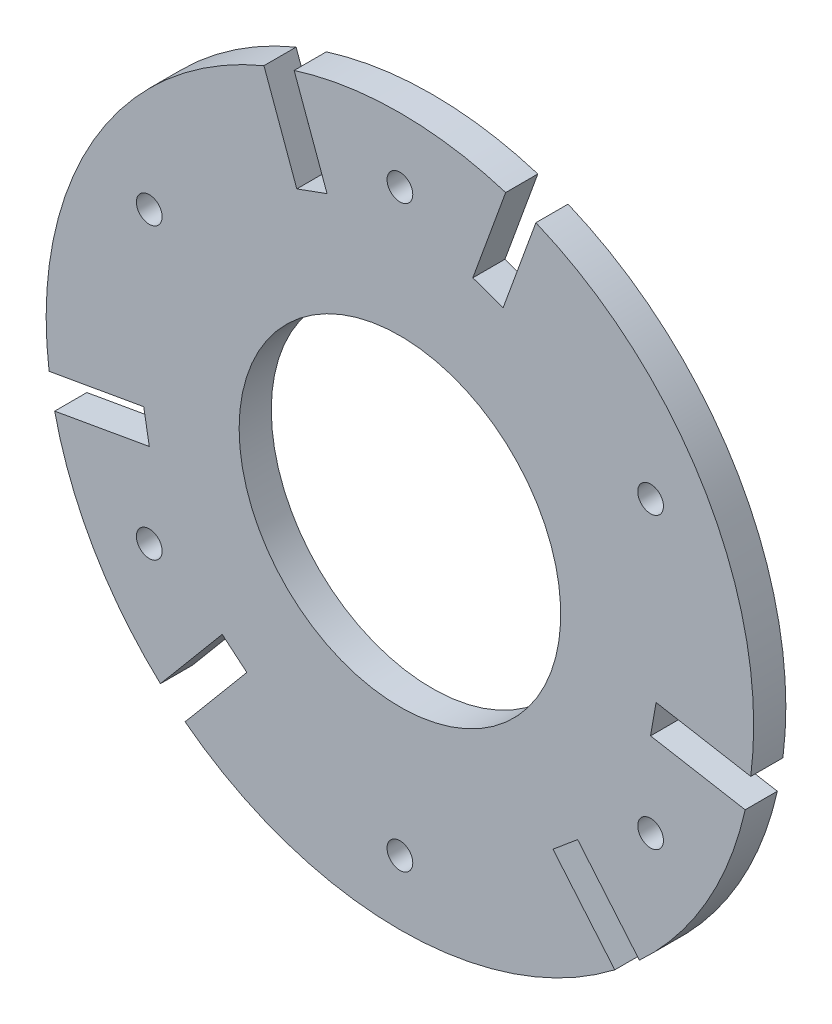
ISO-10303-21;
HEADER;
FILE_DESCRIPTION(('STEP AP214'),'2;1');
FILE_NAME('part.step','',(''),(''),'','','');
FILE_SCHEMA(('AUTOMOTIVE_DESIGN { 1 0 10303 214 1 1 1 1 }'));
ENDSEC;
DATA;
#1=APPLICATION_CONTEXT('core data for automotive mechanical design processes');
#2=APPLICATION_PROTOCOL_DEFINITION('international standard','automotive_design',2000,#1);
#3=PRODUCT_CONTEXT('',#1,'mechanical');
#4=PRODUCT('Part','Part','',(#3));
#5=PRODUCT_RELATED_PRODUCT_CATEGORY('part','',(#4));
#6=PRODUCT_DEFINITION_FORMATION('','',#4);
#7=PRODUCT_DEFINITION_CONTEXT('part definition',#1,'design');
#8=PRODUCT_DEFINITION('design','',#6,#7);
#9=PRODUCT_DEFINITION_SHAPE('','',#8);
#10=(LENGTH_UNIT() NAMED_UNIT(*) SI_UNIT(.MILLI.,.METRE.));
#11=(NAMED_UNIT(*) PLANE_ANGLE_UNIT() SI_UNIT($,.RADIAN.));
#12=(NAMED_UNIT(*) SI_UNIT($,.STERADIAN.) SOLID_ANGLE_UNIT());
#13=UNCERTAINTY_MEASURE_WITH_UNIT(LENGTH_MEASURE(1.E-05),#10,'distance_accuracy_value','');
#14=(GEOMETRIC_REPRESENTATION_CONTEXT(3) GLOBAL_UNCERTAINTY_ASSIGNED_CONTEXT((#13)) GLOBAL_UNIT_ASSIGNED_CONTEXT((#10,
#11,#12)) REPRESENTATION_CONTEXT('',''));
#15=CARTESIAN_POINT('',(0.,0.,0.));
#16=DIRECTION('',(0.,0.,1.));
#17=DIRECTION('',(1.,0.,0.));
#18=AXIS2_PLACEMENT_3D('',#15,#16,#17);
#19=CARTESIAN_POINT('',(0.,0.,5.));
#20=DIRECTION('',(0.,0.,-1.));
#21=DIRECTION('',(-1.,0.,0.));
#22=AXIS2_PLACEMENT_3D('',#19,#20,#21);
#23=CYLINDRICAL_SURFACE('',#22,55.);
#24=CARTESIAN_POINT('',(0.,0.,5.));
#25=DIRECTION('',(0.,0.,1.));
#26=DIRECTION('',(1.,0.,0.));
#27=AXIS2_PLACEMENT_3D('',#24,#25,#26);
#28=CIRCLE('',#27,55.);
#29=CARTESIAN_POINT('',(-53.6743220532715,-12.0027976789453,5.));
#30=VERTEX_POINT('',#29);
#31=CARTESIAN_POINT('',(-37.2318887330751,-40.481927589579,5.));
#32=VERTEX_POINT('',#31);
#33=EDGE_CURVE('E358',#30,#32,#28,.T.);
#34=ORIENTED_EDGE('',*,*,#33,.F.);
#35=DIRECTION('',(0.,0.,-1.));
#36=VECTOR('',#35,1.);
#37=CARTESIAN_POINT('',(-53.6743220532715,-12.0027976789453,5.));
#38=LINE('',#37,#36);
#39=CARTESIAN_POINT('',(-53.6743220532715,-12.0027976789453,0.));
#40=VERTEX_POINT('',#39);
#41=EDGE_CURVE('E228',#30,#40,#38,.T.);
#42=ORIENTED_EDGE('',*,*,#41,.T.);
#43=CARTESIAN_POINT('',(0.,0.,0.));
#44=DIRECTION('',(0.,0.,1.));
#45=DIRECTION('',(1.,0.,0.));
#46=AXIS2_PLACEMENT_3D('',#43,#44,#45);
#47=CIRCLE('',#46,55.);
#48=CARTESIAN_POINT('',(-37.2318887330751,-40.481927589579,0.));
#49=VERTEX_POINT('',#48);
#50=EDGE_CURVE('E362',#40,#49,#47,.T.);
#51=ORIENTED_EDGE('',*,*,#50,.T.);
#52=DIRECTION('',(0.,0.,-1.));
#53=VECTOR('',#52,1.);
#54=CARTESIAN_POINT('',(-37.2318887330751,-40.481927589579,5.));
#55=LINE('',#54,#53);
#56=EDGE_CURVE('E250',#49,#32,#55,.F.);
#57=ORIENTED_EDGE('',*,*,#56,.T.);
#58=EDGE_LOOP('',(#34,#42,#51,#57));
#59=FACE_BOUND('',#58,.T.);
#60=ADVANCED_FACE('F32',(#59),#23,.T.);
#61=CARTESIAN_POINT('',(-21.140896424117,50.7746245518838,0.));
#62=VERTEX_POINT('',#61);
#63=CARTESIAN_POINT('',(-54.5425629416065,-7.07875891388431,0.));
#64=VERTEX_POINT('',#63);
#65=EDGE_CURVE('E360',#62,#64,#47,.T.);
#66=ORIENTED_EDGE('',*,*,#65,.T.);
#67=DIRECTION('',(0.,0.,-1.));
#68=VECTOR('',#67,1.);
#69=CARTESIAN_POINT('',(-54.5425629416065,-7.07875891388431,5.));
#70=LINE('',#69,#68);
#71=CARTESIAN_POINT('',(-54.5425629416065,-7.07875891388431,5.));
#72=VERTEX_POINT('',#71);
#73=EDGE_CURVE('E49',#64,#72,#70,.F.);
#74=ORIENTED_EDGE('',*,*,#73,.T.);
#75=CARTESIAN_POINT('',(-21.140896424117,50.7746245518838,5.));
#76=VERTEX_POINT('',#75);
#77=EDGE_CURVE('E354',#76,#72,#28,.T.);
#78=ORIENTED_EDGE('',*,*,#77,.F.);
#79=DIRECTION('',(0.,0.,-1.));
#80=VECTOR('',#79,1.);
#81=CARTESIAN_POINT('',(-21.140896424117,50.7746245518838,5.));
#82=LINE('',#81,#80);
#83=EDGE_CURVE('E345',#76,#62,#82,.T.);
#84=ORIENTED_EDGE('',*,*,#83,.T.);
#85=EDGE_LOOP('',(#66,#74,#78,#84));
#86=FACE_BOUND('',#85,.T.);
#87=ADVANCED_FACE('F504',(#86),#23,.T.);
#88=CARTESIAN_POINT('',(37.2318887330965,-40.4819275895593,5.));
#89=VERTEX_POINT('',#88);
#90=CARTESIAN_POINT('',(53.6743220532756,-12.0027976789267,5.));
#91=VERTEX_POINT('',#90);
#92=EDGE_CURVE('E427',#89,#91,#28,.T.);
#93=ORIENTED_EDGE('',*,*,#92,.F.);
#94=DIRECTION('',(0.,0.,-1.));
#95=VECTOR('',#94,1.);
#96=CARTESIAN_POINT('',(37.2318887330965,-40.4819275895593,5.));
#97=LINE('',#96,#95);
#98=CARTESIAN_POINT('',(37.2318887330965,-40.4819275895593,0.));
#99=VERTEX_POINT('',#98);
#100=EDGE_CURVE('E275',#89,#99,#97,.T.);
#101=ORIENTED_EDGE('',*,*,#100,.T.);
#102=CARTESIAN_POINT('',(53.6743220532756,-12.0027976789267,0.));
#103=VERTEX_POINT('',#102);
#104=EDGE_CURVE('E450',#99,#103,#47,.T.);
#105=ORIENTED_EDGE('',*,*,#104,.T.);
#106=DIRECTION('',(0.,0.,-1.));
#107=VECTOR('',#106,1.);
#108=CARTESIAN_POINT('',(53.6743220532756,-12.0027976789267,5.));
#109=LINE('',#108,#107);
#110=EDGE_CURVE('E300',#103,#91,#109,.F.);
#111=ORIENTED_EDGE('',*,*,#110,.T.);
#112=EDGE_LOOP('',(#93,#101,#105,#111));
#113=FACE_BOUND('',#112,.T.);
#114=ADVANCED_FACE('F475',(#113),#23,.T.);
#115=CARTESIAN_POINT('',(-33.4016665174794,-43.6958656380108,5.));
#116=VERTEX_POINT('',#115);
#117=CARTESIAN_POINT('',(33.4016665175025,-43.6958656379932,5.));
#118=VERTEX_POINT('',#117);
#119=EDGE_CURVE('E426',#116,#118,#28,.T.);
#120=ORIENTED_EDGE('',*,*,#119,.F.);
#121=DIRECTION('',(0.,0.,-1.));
#122=VECTOR('',#121,1.);
#123=CARTESIAN_POINT('',(-33.4016665174794,-43.6958656380108,5.));
#124=LINE('',#123,#122);
#125=CARTESIAN_POINT('',(-33.4016665174794,-43.6958656380108,0.));
#126=VERTEX_POINT('',#125);
#127=EDGE_CURVE('E246',#116,#126,#124,.T.);
#128=ORIENTED_EDGE('',*,*,#127,.T.);
#129=CARTESIAN_POINT('',(33.4016665175025,-43.6958656379932,0.));
#130=VERTEX_POINT('',#129);
#131=EDGE_CURVE('E454',#126,#130,#47,.T.);
#132=ORIENTED_EDGE('',*,*,#131,.T.);
#133=DIRECTION('',(0.,0.,-1.));
#134=VECTOR('',#133,1.);
#135=CARTESIAN_POINT('',(33.4016665175025,-43.6958656379932,5.));
#136=LINE('',#135,#134);
#137=EDGE_CURVE('E271',#130,#118,#136,.F.);
#138=ORIENTED_EDGE('',*,*,#137,.T.);
#139=EDGE_LOOP('',(#120,#128,#132,#138));
#140=FACE_BOUND('',#139,.T.);
#141=ADVANCED_FACE('F466',(#140),#23,.T.);
#142=CARTESIAN_POINT('',(54.5425629416089,-7.07875891386547,5.));
#143=VERTEX_POINT('',#142);
#144=CARTESIAN_POINT('',(21.140896424117,50.7746245518838,5.));
#145=VERTEX_POINT('',#144);
#146=EDGE_CURVE('E431',#143,#145,#28,.T.);
#147=ORIENTED_EDGE('',*,*,#146,.F.);
#148=DIRECTION('',(0.,0.,-1.));
#149=VECTOR('',#148,1.);
#150=CARTESIAN_POINT('',(54.5425629416089,-7.07875891386547,5.));
#151=LINE('',#150,#149);
#152=CARTESIAN_POINT('',(54.5425629416089,-7.07875891386547,0.));
#153=VERTEX_POINT('',#152);
#154=EDGE_CURVE('E295',#143,#153,#151,.T.);
#155=ORIENTED_EDGE('',*,*,#154,.T.);
#156=CARTESIAN_POINT('',(21.140896424117,50.7746245518838,0.));
#157=VERTEX_POINT('',#156);
#158=EDGE_CURVE('E449',#153,#157,#47,.T.);
#159=ORIENTED_EDGE('',*,*,#158,.T.);
#160=DIRECTION('',(0.,0.,-1.));
#161=VECTOR('',#160,1.);
#162=CARTESIAN_POINT('',(21.140896424117,50.7746245518838,5.));
#163=LINE('',#162,#161);
#164=EDGE_CURVE('E325',#157,#145,#163,.F.);
#165=ORIENTED_EDGE('',*,*,#164,.T.);
#166=EDGE_LOOP('',(#147,#155,#159,#165));
#167=FACE_BOUND('',#166,.T.);
#168=ADVANCED_FACE('F485',(#167),#23,.T.);
#169=CARTESIAN_POINT('',(16.4424333201875,52.4847252685121,5.));
#170=VERTEX_POINT('',#169);
#171=CARTESIAN_POINT('',(-16.4424333201875,52.4847252685121,5.));
#172=VERTEX_POINT('',#171);
#173=EDGE_CURVE('E359',#170,#172,#28,.T.);
#174=ORIENTED_EDGE('',*,*,#173,.F.);
#175=DIRECTION('',(0.,0.,-1.));
#176=VECTOR('',#175,1.);
#177=CARTESIAN_POINT('',(16.4424333201875,52.4847252685121,5.));
#178=LINE('',#177,#176);
#179=CARTESIAN_POINT('',(16.4424333201875,52.4847252685121,0.));
#180=VERTEX_POINT('',#179);
#181=EDGE_CURVE('E320',#170,#180,#178,.T.);
#182=ORIENTED_EDGE('',*,*,#181,.T.);
#183=CARTESIAN_POINT('',(-16.4424333201875,52.4847252685121,0.));
#184=VERTEX_POINT('',#183);
#185=EDGE_CURVE('E353',#180,#184,#47,.T.);
#186=ORIENTED_EDGE('',*,*,#185,.T.);
#187=DIRECTION('',(0.,0.,-1.));
#188=VECTOR('',#187,1.);
#189=CARTESIAN_POINT('',(-16.4424333201875,52.4847252685121,5.));
#190=LINE('',#189,#188);
#191=EDGE_CURVE('E350',#184,#172,#190,.F.);
#192=ORIENTED_EDGE('',*,*,#191,.T.);
#193=EDGE_LOOP('',(#174,#182,#186,#192));
#194=FACE_BOUND('',#193,.T.);
#195=ADVANCED_FACE('F34',(#194),#23,.T.);
#196=CARTESIAN_POINT('',(0.,0.,5.));
#197=DIRECTION('',(0.,0.,1.));
#198=DIRECTION('',(1.,0.,0.));
#199=AXIS2_PLACEMENT_3D('',#196,#197,#198);
#200=PLANE('',#199);
#201=CARTESIAN_POINT('',(0.,0.,5.));
#202=DIRECTION('',(0.,0.,-1.));
#203=DIRECTION('',(-1.,0.,0.));
#204=AXIS2_PLACEMENT_3D('',#201,#202,#203);
#205=CIRCLE('',#204,25.);
#206=CARTESIAN_POINT('',(-25.,0.,5.));
#207=VERTEX_POINT('',#206);
#208=EDGE_CURVE('E765',#207,#207,#205,.T.);
#209=ORIENTED_EDGE('',*,*,#208,.T.);
#210=EDGE_LOOP('',(#209));
#211=FACE_BOUND('',#210,.T.);
#212=CARTESIAN_POINT('',(38.9711431702999,22.4999999999996,5.));
#213=DIRECTION('',(0.,0.,1.));
#214=DIRECTION('',(1.,0.,0.));
#215=AXIS2_PLACEMENT_3D('',#212,#213,#214);
#216=CIRCLE('',#215,2.);
#217=CARTESIAN_POINT('',(40.9711431702999,22.4999999999996,5.));
#218=VERTEX_POINT('',#217);
#219=EDGE_CURVE('E401',#218,#218,#216,.T.);
#220=ORIENTED_EDGE('',*,*,#219,.F.);
#221=EDGE_LOOP('',(#220));
#222=FACE_BOUND('',#221,.T.);
#223=CARTESIAN_POINT('',(-38.9711431702997,-22.5,5.));
#224=DIRECTION('',(0.,0.,1.));
#225=DIRECTION('',(1.,0.,0.));
#226=AXIS2_PLACEMENT_3D('',#223,#224,#225);
#227=CIRCLE('',#226,2.);
#228=CARTESIAN_POINT('',(-36.9711431702997,-22.5,5.));
#229=VERTEX_POINT('',#228);
#230=EDGE_CURVE('E391',#229,#229,#227,.T.);
#231=ORIENTED_EDGE('',*,*,#230,.F.);
#232=EDGE_LOOP('',(#231));
#233=FACE_BOUND('',#232,.T.);
#234=CARTESIAN_POINT('',(38.9711431702997,-22.5,5.));
#235=DIRECTION('',(0.,0.,1.));
#236=DIRECTION('',(1.,0.,0.));
#237=AXIS2_PLACEMENT_3D('',#234,#235,#236);
#238=CIRCLE('',#237,2.);
#239=CARTESIAN_POINT('',(40.9711431702997,-22.5,5.));
#240=VERTEX_POINT('',#239);
#241=EDGE_CURVE('E388',#240,#240,#238,.T.);
#242=ORIENTED_EDGE('',*,*,#241,.F.);
#243=EDGE_LOOP('',(#242));
#244=FACE_BOUND('',#243,.T.);
#245=CARTESIAN_POINT('',(-38.9711431702996,22.5000000000002,5.));
#246=DIRECTION('',(0.,0.,1.));
#247=DIRECTION('',(1.,0.,0.));
#248=AXIS2_PLACEMENT_3D('',#245,#246,#247);
#249=CIRCLE('',#248,2.);
#250=CARTESIAN_POINT('',(-36.9711431702996,22.5000000000002,5.));
#251=VERTEX_POINT('',#250);
#252=EDGE_CURVE('E385',#251,#251,#249,.T.);
#253=ORIENTED_EDGE('',*,*,#252,.F.);
#254=EDGE_LOOP('',(#253));
#255=FACE_BOUND('',#254,.T.);
#256=CARTESIAN_POINT('',(0.,-45.,5.));
#257=DIRECTION('',(0.,0.,1.));
#258=DIRECTION('',(1.,0.,0.));
#259=AXIS2_PLACEMENT_3D('',#256,#257,#258);
#260=CIRCLE('',#259,2.);
#261=CARTESIAN_POINT('',(2.00000000000001,-45.,5.));
#262=VERTEX_POINT('',#261);
#263=EDGE_CURVE('E381',#262,#262,#260,.T.);
#264=ORIENTED_EDGE('',*,*,#263,.F.);
#265=EDGE_LOOP('',(#264));
#266=FACE_BOUND('',#265,.T.);
#267=CARTESIAN_POINT('',(0.,45.,5.));
#268=DIRECTION('',(0.,0.,1.));
#269=DIRECTION('',(1.,0.,0.));
#270=AXIS2_PLACEMENT_3D('',#267,#268,#269);
#271=CIRCLE('',#270,2.);
#272=CARTESIAN_POINT('',(2.,45.,5.));
#273=VERTEX_POINT('',#272);
#274=EDGE_CURVE('E220',#273,#273,#271,.T.);
#275=ORIENTED_EDGE('',*,*,#274,.F.);
#276=EDGE_LOOP('',(#275));
#277=FACE_BOUND('',#276,.T.);
#278=DIRECTION('',(0.984807753012207,0.173648177666937,0.));
#279=VECTOR('',#278,1.);
#280=CARTESIAN_POINT('',(-38.9618236684253,-9.4085872600671,5.));
#281=LINE('',#280,#279);
#282=CARTESIAN_POINT('',(-38.9618236684253,-9.4085872600671,5.));
#283=VERTEX_POINT('',#282);
#284=EDGE_CURVE('E215',#30,#283,#281,.T.);
#285=ORIENTED_EDGE('',*,*,#284,.F.);
#286=ORIENTED_EDGE('',*,*,#33,.T.);
#287=DIRECTION('',(-0.642787609686543,-0.766044443118975,0.));
#288=VECTOR('',#287,1.);
#289=CARTESIAN_POINT('',(-27.6289874151446,-29.0376354446078,5.));
#290=LINE('',#289,#288);
#291=CARTESIAN_POINT('',(-27.6289874151446,-29.0376354446078,5.));
#292=VERTEX_POINT('',#291);
#293=EDGE_CURVE('E234',#292,#32,#290,.T.);
#294=ORIENTED_EDGE('',*,*,#293,.F.);
#295=DIRECTION('',(-0.766044443118975,0.642787609686543,0.));
#296=VECTOR('',#295,1.);
#297=CARTESIAN_POINT('',(-23.7987651995497,-32.2515734930406,5.));
#298=LINE('',#297,#296);
#299=CARTESIAN_POINT('',(-23.7987651995497,-32.2515734930406,5.));
#300=VERTEX_POINT('',#299);
#301=EDGE_CURVE('E239',#300,#292,#298,.T.);
#302=ORIENTED_EDGE('',*,*,#301,.F.);
#303=DIRECTION('',(0.642787609686544,0.766044443118974,0.));
#304=VECTOR('',#303,1.);
#305=CARTESIAN_POINT('',(-33.4405793448479,-43.7422401398252,5.));
#306=LINE('',#305,#304);
#307=EDGE_CURVE('E231',#116,#300,#306,.T.);
#308=ORIENTED_EDGE('',*,*,#307,.F.);
#309=ORIENTED_EDGE('',*,*,#119,.T.);
#310=DIRECTION('',(0.642787609686545,-0.766044443118974,0.));
#311=VECTOR('',#310,1.);
#312=CARTESIAN_POINT('',(33.4405793448734,-43.7422401398104,5.));
#313=LINE('',#312,#311);
#314=CARTESIAN_POINT('',(23.7987651995753,-32.2515734930258,5.));
#315=VERTEX_POINT('',#314);
#316=EDGE_CURVE('E264',#315,#118,#313,.T.);
#317=ORIENTED_EDGE('',*,*,#316,.F.);
#318=DIRECTION('',(-0.766044443118974,-0.642787609686544,0.));
#319=VECTOR('',#318,1.);
#320=CARTESIAN_POINT('',(23.7987651995753,-32.2515734930258,5.));
#321=LINE('',#320,#319);
#322=CARTESIAN_POINT('',(27.6289874151701,-29.0376354445931,5.));
#323=VERTEX_POINT('',#322);
#324=EDGE_CURVE('E253',#323,#315,#321,.T.);
#325=ORIENTED_EDGE('',*,*,#324,.F.);
#326=DIRECTION('',(-0.642787609686544,0.766044443118974,0.));
#327=VECTOR('',#326,1.);
#328=CARTESIAN_POINT('',(27.6289874151701,-29.0376354445931,5.));
#329=LINE('',#328,#327);
#330=EDGE_CURVE('E258',#89,#323,#329,.T.);
#331=ORIENTED_EDGE('',*,*,#330,.F.);
#332=ORIENTED_EDGE('',*,*,#92,.T.);
#333=DIRECTION('',(0.984807753012207,-0.173648177666936,0.));
#334=VECTOR('',#333,1.);
#335=CARTESIAN_POINT('',(38.9618236684509,-9.40858726005234,5.));
#336=LINE('',#335,#334);
#337=CARTESIAN_POINT('',(38.9618236684509,-9.40858726005234,5.));
#338=VERTEX_POINT('',#337);
#339=EDGE_CURVE('E283',#338,#91,#336,.T.);
#340=ORIENTED_EDGE('',*,*,#339,.F.);
#341=DIRECTION('',(-0.173648177666935,-0.984807753012207,0.));
#342=VECTOR('',#341,1.);
#343=CARTESIAN_POINT('',(39.8300645567856,-4.4845484949913,5.));
#344=LINE('',#343,#342);
#345=CARTESIAN_POINT('',(39.8300645567856,-4.4845484949913,5.));
#346=VERTEX_POINT('',#345);
#347=EDGE_CURVE('E288',#346,#338,#344,.T.);
#348=ORIENTED_EDGE('',*,*,#347,.F.);
#349=DIRECTION('',(-0.984807753012207,0.173648177666936,0.));
#350=VECTOR('',#349,1.);
#351=CARTESIAN_POINT('',(54.6021808519687,-7.08927115999535,5.));
#352=LINE('',#351,#350);
#353=EDGE_CURVE('E278',#143,#346,#352,.T.);
#354=ORIENTED_EDGE('',*,*,#353,.F.);
#355=ORIENTED_EDGE('',*,*,#146,.T.);
#356=DIRECTION('',(0.342020143325662,0.939692620785911,0.));
#357=VECTOR('',#356,1.);
#358=CARTESIAN_POINT('',(21.1616015070952,50.8315112998343,5.));
#359=LINE('',#358,#357);
#360=CARTESIAN_POINT('',(16.0312993572103,36.7361219880456,5.));
#361=VERTEX_POINT('',#360);
#362=EDGE_CURVE('E303',#361,#145,#359,.T.);
#363=ORIENTED_EDGE('',*,*,#362,.F.);
#364=DIRECTION('',(0.939692620785911,-0.342020143325662,0.));
#365=VECTOR('',#364,1.);
#366=CARTESIAN_POINT('',(16.0312993572103,36.7361219880456,5.));
#367=LINE('',#366,#365);
#368=CARTESIAN_POINT('',(11.3328362532807,38.446222704674,5.));
#369=VERTEX_POINT('',#368);
#370=EDGE_CURVE('E308',#369,#361,#367,.T.);
#371=ORIENTED_EDGE('',*,*,#370,.F.);
#372=DIRECTION('',(-0.342020143325663,-0.939692620785911,0.));
#373=VECTOR('',#372,1.);
#374=CARTESIAN_POINT('',(11.3328362532807,38.446222704674,5.));
#375=LINE('',#374,#373);
#376=EDGE_CURVE('E314',#170,#369,#375,.T.);
#377=ORIENTED_EDGE('',*,*,#376,.F.);
#378=ORIENTED_EDGE('',*,*,#173,.T.);
#379=DIRECTION('',(-0.342020143325663,0.93969262078591,0.));
#380=VECTOR('',#379,1.);
#381=CARTESIAN_POINT('',(-11.3328362532807,38.446222704674,5.));
#382=LINE('',#381,#380);
#383=CARTESIAN_POINT('',(-11.3328362532807,38.446222704674,5.));
#384=VERTEX_POINT('',#383);
#385=EDGE_CURVE('E333',#384,#172,#382,.T.);
#386=ORIENTED_EDGE('',*,*,#385,.F.);
#387=DIRECTION('',(0.93969262078591,0.342020143325663,0.));
#388=VECTOR('',#387,1.);
#389=CARTESIAN_POINT('',(-16.0312993572103,36.7361219880456,5.));
#390=LINE('',#389,#388);
#391=CARTESIAN_POINT('',(-16.0312993572103,36.7361219880456,5.));
#392=VERTEX_POINT('',#391);
#393=EDGE_CURVE('E338',#392,#384,#390,.T.);
#394=ORIENTED_EDGE('',*,*,#393,.F.);
#395=DIRECTION('',(0.342020143325663,-0.939692620785911,0.));
#396=VECTOR('',#395,1.);
#397=CARTESIAN_POINT('',(-21.1616015070952,50.8315112998343,5.));
#398=LINE('',#397,#396);
#399=EDGE_CURVE('E328',#76,#392,#398,.T.);
#400=ORIENTED_EDGE('',*,*,#399,.F.);
#401=ORIENTED_EDGE('',*,*,#77,.T.);
#402=DIRECTION('',(-0.984807753012207,-0.173648177666937,0.));
#403=VECTOR('',#402,1.);
#404=CARTESIAN_POINT('',(-54.6021808519431,-7.08927116001013,5.));
#405=LINE('',#404,#403);
#406=CARTESIAN_POINT('',(-39.83006455676,-4.48454849500607,5.));
#407=VERTEX_POINT('',#406);
#408=EDGE_CURVE('E217',#407,#72,#405,.T.);
#409=ORIENTED_EDGE('',*,*,#408,.F.);
#410=DIRECTION('',(-0.173648177666938,0.984807753012207,0.));
#411=VECTOR('',#410,1.);
#412=CARTESIAN_POINT('',(-39.83006455676,-4.48454849500607,5.));
#413=LINE('',#412,#411);
#414=EDGE_CURVE('E203',#283,#407,#413,.T.);
#415=ORIENTED_EDGE('',*,*,#414,.F.);
#416=EDGE_LOOP('',(#285,#286,#294,#302,#308,#309,#317,#325,#331,#332,#340,#348,#354,#355,#363,
#371,#377,#378,#386,#394,#400,#401,#409,#415));
#417=FACE_BOUND('',#416,.T.);
#418=ADVANCED_FACE('F412',(#211,#222,#233,#244,#255,#266,#277,#417),#200,.T.);
#419=CARTESIAN_POINT('',(0.,0.,0.));
#420=DIRECTION('',(0.,0.,1.));
#421=DIRECTION('',(1.,0.,0.));
#422=AXIS2_PLACEMENT_3D('',#419,#420,#421);
#423=PLANE('',#422);
#424=CARTESIAN_POINT('',(0.,0.,0.));
#425=DIRECTION('',(0.,0.,-1.));
#426=DIRECTION('',(-1.,0.,0.));
#427=AXIS2_PLACEMENT_3D('',#424,#425,#426);
#428=CIRCLE('',#427,25.);
#429=CARTESIAN_POINT('',(-25.,0.,0.));
#430=VERTEX_POINT('',#429);
#431=EDGE_CURVE('E750',#430,#430,#428,.T.);
#432=ORIENTED_EDGE('',*,*,#431,.F.);
#433=EDGE_LOOP('',(#432));
#434=FACE_BOUND('',#433,.T.);
#435=CARTESIAN_POINT('',(38.9711431702999,22.4999999999996,0.));
#436=DIRECTION('',(0.,0.,1.));
#437=DIRECTION('',(1.,0.,0.));
#438=AXIS2_PLACEMENT_3D('',#435,#436,#437);
#439=CIRCLE('',#438,2.);
#440=CARTESIAN_POINT('',(40.9711431702999,22.4999999999996,0.));
#441=VERTEX_POINT('',#440);
#442=EDGE_CURVE('E36',#441,#441,#439,.T.);
#443=ORIENTED_EDGE('',*,*,#442,.T.);
#444=EDGE_LOOP('',(#443));
#445=FACE_BOUND('',#444,.T.);
#446=CARTESIAN_POINT('',(-38.9711431702997,-22.5,0.));
#447=DIRECTION('',(0.,0.,1.));
#448=DIRECTION('',(1.,0.,0.));
#449=AXIS2_PLACEMENT_3D('',#446,#447,#448);
#450=CIRCLE('',#449,2.);
#451=CARTESIAN_POINT('',(-36.9711431702997,-22.5,0.));
#452=VERTEX_POINT('',#451);
#453=EDGE_CURVE('E389',#452,#452,#450,.T.);
#454=ORIENTED_EDGE('',*,*,#453,.T.);
#455=EDGE_LOOP('',(#454));
#456=FACE_BOUND('',#455,.T.);
#457=CARTESIAN_POINT('',(38.9711431702997,-22.5,0.));
#458=DIRECTION('',(0.,0.,1.));
#459=DIRECTION('',(1.,0.,0.));
#460=AXIS2_PLACEMENT_3D('',#457,#458,#459);
#461=CIRCLE('',#460,2.);
#462=CARTESIAN_POINT('',(40.9711431702997,-22.5,0.));
#463=VERTEX_POINT('',#462);
#464=EDGE_CURVE('E386',#463,#463,#461,.T.);
#465=ORIENTED_EDGE('',*,*,#464,.T.);
#466=EDGE_LOOP('',(#465));
#467=FACE_BOUND('',#466,.T.);
#468=CARTESIAN_POINT('',(-38.9711431702996,22.5000000000002,0.));
#469=DIRECTION('',(0.,0.,1.));
#470=DIRECTION('',(1.,0.,0.));
#471=AXIS2_PLACEMENT_3D('',#468,#469,#470);
#472=CIRCLE('',#471,2.);
#473=CARTESIAN_POINT('',(-36.9711431702996,22.5000000000002,0.));
#474=VERTEX_POINT('',#473);
#475=EDGE_CURVE('E382',#474,#474,#472,.T.);
#476=ORIENTED_EDGE('',*,*,#475,.T.);
#477=EDGE_LOOP('',(#476));
#478=FACE_BOUND('',#477,.T.);
#479=CARTESIAN_POINT('',(0.,-45.,0.));
#480=DIRECTION('',(0.,0.,1.));
#481=DIRECTION('',(1.,0.,0.));
#482=AXIS2_PLACEMENT_3D('',#479,#480,#481);
#483=CIRCLE('',#482,2.);
#484=CARTESIAN_POINT('',(2.00000000000001,-45.,0.));
#485=VERTEX_POINT('',#484);
#486=EDGE_CURVE('E378',#485,#485,#483,.T.);
#487=ORIENTED_EDGE('',*,*,#486,.T.);
#488=EDGE_LOOP('',(#487));
#489=FACE_BOUND('',#488,.T.);
#490=CARTESIAN_POINT('',(0.,45.,0.));
#491=DIRECTION('',(0.,0.,1.));
#492=DIRECTION('',(1.,0.,0.));
#493=AXIS2_PLACEMENT_3D('',#490,#491,#492);
#494=CIRCLE('',#493,2.);
#495=CARTESIAN_POINT('',(2.,45.,0.));
#496=VERTEX_POINT('',#495);
#497=EDGE_CURVE('E224',#496,#496,#494,.T.);
#498=ORIENTED_EDGE('',*,*,#497,.T.);
#499=EDGE_LOOP('',(#498));
#500=FACE_BOUND('',#499,.T.);
#501=ORIENTED_EDGE('',*,*,#50,.F.);
#502=DIRECTION('',(0.984807753012207,0.173648177666937,0.));
#503=VECTOR('',#502,1.);
#504=CARTESIAN_POINT('',(0.434120444167925,-2.46201938253382,0.));
#505=LINE('',#504,#503);
#506=CARTESIAN_POINT('',(-38.9618236684253,-9.4085872600671,0.));
#507=VERTEX_POINT('',#506);
#508=EDGE_CURVE('E11',#40,#507,#505,.T.);
#509=ORIENTED_EDGE('',*,*,#508,.T.);
#510=DIRECTION('',(-0.173648177666938,0.984807753012207,0.));
#511=VECTOR('',#510,1.);
#512=CARTESIAN_POINT('',(-39.83006455676,-4.48454849500607,0.));
#513=LINE('',#512,#511);
#514=CARTESIAN_POINT('',(-39.83006455676,-4.48454849500607,0.));
#515=VERTEX_POINT('',#514);
#516=EDGE_CURVE('E201',#507,#515,#513,.T.);
#517=ORIENTED_EDGE('',*,*,#516,.T.);
#518=DIRECTION('',(-0.984807753012207,-0.173648177666937,0.));
#519=VECTOR('',#518,1.);
#520=CARTESIAN_POINT('',(-54.6021808519431,-7.08927116001013,0.));
#521=LINE('',#520,#519);
#522=EDGE_CURVE('E206',#515,#64,#521,.T.);
#523=ORIENTED_EDGE('',*,*,#522,.T.);
#524=ORIENTED_EDGE('',*,*,#65,.F.);
#525=DIRECTION('',(0.342020143325663,-0.939692620785911,0.));
#526=VECTOR('',#525,1.);
#527=CARTESIAN_POINT('',(-2.34923155196479,-0.855050358314162,0.));
#528=LINE('',#527,#526);
#529=CARTESIAN_POINT('',(-16.0312993572103,36.7361219880456,0.));
#530=VERTEX_POINT('',#529);
#531=EDGE_CURVE('E357',#62,#530,#528,.T.);
#532=ORIENTED_EDGE('',*,*,#531,.T.);
#533=DIRECTION('',(0.93969262078591,0.342020143325663,0.));
#534=VECTOR('',#533,1.);
#535=CARTESIAN_POINT('',(-16.0312993572103,36.7361219880456,0.));
#536=LINE('',#535,#534);
#537=CARTESIAN_POINT('',(-11.3328362532807,38.446222704674,0.));
#538=VERTEX_POINT('',#537);
#539=EDGE_CURVE('E329',#530,#538,#536,.T.);
#540=ORIENTED_EDGE('',*,*,#539,.T.);
#541=DIRECTION('',(-0.342020143325663,0.93969262078591,0.));
#542=VECTOR('',#541,1.);
#543=CARTESIAN_POINT('',(-11.3328362532807,38.446222704674,0.));
#544=LINE('',#543,#542);
#545=EDGE_CURVE('E332',#538,#184,#544,.T.);
#546=ORIENTED_EDGE('',*,*,#545,.T.);
#547=ORIENTED_EDGE('',*,*,#185,.F.);
#548=DIRECTION('',(-0.342020143325663,-0.939692620785911,0.));
#549=VECTOR('',#548,1.);
#550=CARTESIAN_POINT('',(-2.34923155196476,0.85505035831415,0.));
#551=LINE('',#550,#549);
#552=CARTESIAN_POINT('',(11.3328362532807,38.4462227046739,0.));
#553=VERTEX_POINT('',#552);
#554=EDGE_CURVE('E365',#180,#553,#551,.T.);
#555=ORIENTED_EDGE('',*,*,#554,.T.);
#556=DIRECTION('',(0.939692620785911,-0.342020143325662,0.));
#557=VECTOR('',#556,1.);
#558=CARTESIAN_POINT('',(16.0312993572103,36.7361219880456,0.));
#559=LINE('',#558,#557);
#560=CARTESIAN_POINT('',(16.0312993572103,36.7361219880456,0.));
#561=VERTEX_POINT('',#560);
#562=EDGE_CURVE('E307',#553,#561,#559,.T.);
#563=ORIENTED_EDGE('',*,*,#562,.T.);
#564=DIRECTION('',(0.342020143325662,0.939692620785911,0.));
#565=VECTOR('',#564,1.);
#566=CARTESIAN_POINT('',(21.1616015070952,50.8315112998343,0.));
#567=LINE('',#566,#565);
#568=EDGE_CURVE('E304',#561,#157,#567,.T.);
#569=ORIENTED_EDGE('',*,*,#568,.T.);
#570=ORIENTED_EDGE('',*,*,#158,.F.);
#571=DIRECTION('',(-0.984807753012207,0.173648177666936,0.));
#572=VECTOR('',#571,1.);
#573=CARTESIAN_POINT('',(0.434120444170045,2.46201938254586,0.));
#574=LINE('',#573,#572);
#575=CARTESIAN_POINT('',(39.8300645567855,-4.4845484949913,0.));
#576=VERTEX_POINT('',#575);
#577=EDGE_CURVE('E368',#153,#576,#574,.T.);
#578=ORIENTED_EDGE('',*,*,#577,.T.);
#579=DIRECTION('',(-0.173648177666935,-0.984807753012207,0.));
#580=VECTOR('',#579,1.);
#581=CARTESIAN_POINT('',(39.8300645567856,-4.4845484949913,0.));
#582=LINE('',#581,#580);
#583=CARTESIAN_POINT('',(38.9618236684509,-9.40858726005234,0.));
#584=VERTEX_POINT('',#583);
#585=EDGE_CURVE('E279',#576,#584,#582,.T.);
#586=ORIENTED_EDGE('',*,*,#585,.T.);
#587=DIRECTION('',(0.984807753012207,-0.173648177666936,0.));
#588=VECTOR('',#587,1.);
#589=CARTESIAN_POINT('',(38.9618236684509,-9.40858726005234,0.));
#590=LINE('',#589,#588);
#591=EDGE_CURVE('E282',#584,#103,#590,.T.);
#592=ORIENTED_EDGE('',*,*,#591,.T.);
#593=ORIENTED_EDGE('',*,*,#104,.F.);
#594=DIRECTION('',(-0.642787609686545,0.766044443118974,0.));
#595=VECTOR('',#594,1.);
#596=CARTESIAN_POINT('',(1.91511110780959,1.60696902422656,0.));
#597=LINE('',#596,#595);
#598=CARTESIAN_POINT('',(27.6289874151701,-29.0376354445931,0.));
#599=VERTEX_POINT('',#598);
#600=EDGE_CURVE('E371',#99,#599,#597,.T.);
#601=ORIENTED_EDGE('',*,*,#600,.T.);
#602=DIRECTION('',(-0.766044443118974,-0.642787609686544,0.));
#603=VECTOR('',#602,1.);
#604=CARTESIAN_POINT('',(23.7987651995753,-32.2515734930258,0.));
#605=LINE('',#604,#603);
#606=CARTESIAN_POINT('',(23.7987651995753,-32.2515734930258,0.));
#607=VERTEX_POINT('',#606);
#608=EDGE_CURVE('E254',#599,#607,#605,.T.);
#609=ORIENTED_EDGE('',*,*,#608,.T.);
#610=DIRECTION('',(0.642787609686545,-0.766044443118974,0.));
#611=VECTOR('',#610,1.);
#612=CARTESIAN_POINT('',(33.4405793448734,-43.7422401398104,0.));
#613=LINE('',#612,#611);
#614=EDGE_CURVE('E257',#607,#130,#613,.T.);
#615=ORIENTED_EDGE('',*,*,#614,.T.);
#616=ORIENTED_EDGE('',*,*,#131,.F.);
#617=DIRECTION('',(0.642787609686544,0.766044443118974,0.));
#618=VECTOR('',#617,1.);
#619=CARTESIAN_POINT('',(1.91511110780752,-1.60696902422482,0.));
#620=LINE('',#619,#618);
#621=CARTESIAN_POINT('',(-23.7987651995497,-32.2515734930406,0.));
#622=VERTEX_POINT('',#621);
#623=EDGE_CURVE('E41',#126,#622,#620,.T.);
#624=ORIENTED_EDGE('',*,*,#623,.T.);
#625=DIRECTION('',(-0.766044443118975,0.642787609686543,0.));
#626=VECTOR('',#625,1.);
#627=CARTESIAN_POINT('',(-23.7987651995497,-32.2515734930406,0.));
#628=LINE('',#627,#626);
#629=CARTESIAN_POINT('',(-27.6289874151446,-29.0376354446078,0.));
#630=VERTEX_POINT('',#629);
#631=EDGE_CURVE('E57',#622,#630,#628,.T.);
#632=ORIENTED_EDGE('',*,*,#631,.T.);
#633=DIRECTION('',(-0.642787609686543,-0.766044443118975,0.));
#634=VECTOR('',#633,1.);
#635=CARTESIAN_POINT('',(-27.6289874151446,-29.0376354446078,0.));
#636=LINE('',#635,#634);
#637=EDGE_CURVE('E233',#630,#49,#636,.T.);
#638=ORIENTED_EDGE('',*,*,#637,.T.);
#639=EDGE_LOOP('',(#501,#509,#517,#523,#524,#532,#540,#546,#547,#555,#563,#569,#570,#578,#586,
#592,#593,#601,#609,#615,#616,#624,#632,#638));
#640=FACE_BOUND('',#639,.T.);
#641=ADVANCED_FACE('F214',(#434,#445,#456,#467,#478,#489,#500,#640),#423,.F.);
#642=CARTESIAN_POINT('',(-11.3328362532807,38.446222704674,0.));
#643=DIRECTION('',(0.93969262078591,0.342020143325663,0.));
#644=DIRECTION('',(-0.342020143325663,0.939692620785911,0.));
#645=AXIS2_PLACEMENT_3D('',#642,#643,#644);
#646=PLANE('',#645);
#647=ORIENTED_EDGE('',*,*,#545,.F.);
#648=DIRECTION('',(0.,0.,1.));
#649=VECTOR('',#648,1.);
#650=CARTESIAN_POINT('',(-11.3328362532807,38.446222704674,0.));
#651=LINE('',#650,#649);
#652=EDGE_CURVE('E343',#538,#384,#651,.T.);
#653=ORIENTED_EDGE('',*,*,#652,.T.);
#654=ORIENTED_EDGE('',*,*,#385,.T.);
#655=ORIENTED_EDGE('',*,*,#191,.F.);
#656=EDGE_LOOP('',(#647,#653,#654,#655));
#657=FACE_BOUND('',#656,.T.);
#658=ADVANCED_FACE('F447',(#657),#646,.F.);
#659=CARTESIAN_POINT('',(-21.1616015070952,50.8315112998343,0.));
#660=DIRECTION('',(-0.939692620785911,-0.342020143325663,0.));
#661=DIRECTION('',(0.342020143325663,-0.939692620785911,0.));
#662=AXIS2_PLACEMENT_3D('',#659,#660,#661);
#663=PLANE('',#662);
#664=ORIENTED_EDGE('',*,*,#399,.T.);
#665=DIRECTION('',(0.,0.,1.));
#666=VECTOR('',#665,1.);
#667=CARTESIAN_POINT('',(-16.0312993572103,36.7361219880456,0.));
#668=LINE('',#667,#666);
#669=EDGE_CURVE('E336',#530,#392,#668,.T.);
#670=ORIENTED_EDGE('',*,*,#669,.F.);
#671=ORIENTED_EDGE('',*,*,#531,.F.);
#672=ORIENTED_EDGE('',*,*,#83,.F.);
#673=EDGE_LOOP('',(#664,#670,#671,#672));
#674=FACE_BOUND('',#673,.T.);
#675=ADVANCED_FACE('F541',(#674),#663,.F.);
#676=CARTESIAN_POINT('',(-16.0312993572103,36.7361219880456,0.));
#677=DIRECTION('',(0.342020143325663,-0.93969262078591,0.));
#678=DIRECTION('',(0.93969262078591,0.342020143325663,0.));
#679=AXIS2_PLACEMENT_3D('',#676,#677,#678);
#680=PLANE('',#679);
#681=ORIENTED_EDGE('',*,*,#393,.T.);
#682=ORIENTED_EDGE('',*,*,#652,.F.);
#683=ORIENTED_EDGE('',*,*,#539,.F.);
#684=ORIENTED_EDGE('',*,*,#669,.T.);
#685=EDGE_LOOP('',(#681,#682,#683,#684));
#686=FACE_BOUND('',#685,.T.);
#687=ADVANCED_FACE('F501',(#686),#680,.F.);
#688=CARTESIAN_POINT('',(21.1616015070952,50.8315112998343,0.));
#689=DIRECTION('',(0.939692620785911,-0.342020143325662,0.));
#690=DIRECTION('',(0.342020143325662,0.939692620785911,0.));
#691=AXIS2_PLACEMENT_3D('',#688,#689,#690);
#692=PLANE('',#691);
#693=ORIENTED_EDGE('',*,*,#568,.F.);
#694=DIRECTION('',(0.,0.,1.));
#695=VECTOR('',#694,1.);
#696=CARTESIAN_POINT('',(16.0312993572103,36.7361219880456,0.));
#697=LINE('',#696,#695);
#698=EDGE_CURVE('E318',#561,#361,#697,.T.);
#699=ORIENTED_EDGE('',*,*,#698,.T.);
#700=ORIENTED_EDGE('',*,*,#362,.T.);
#701=ORIENTED_EDGE('',*,*,#164,.F.);
#702=EDGE_LOOP('',(#693,#699,#700,#701));
#703=FACE_BOUND('',#702,.T.);
#704=ADVANCED_FACE('F488',(#703),#692,.F.);
#705=CARTESIAN_POINT('',(11.3328362532807,38.446222704674,0.));
#706=DIRECTION('',(-0.939692620785911,0.342020143325663,0.));
#707=DIRECTION('',(-0.342020143325663,-0.939692620785911,0.));
#708=AXIS2_PLACEMENT_3D('',#705,#706,#707);
#709=PLANE('',#708);
#710=ORIENTED_EDGE('',*,*,#376,.T.);
#711=DIRECTION('',(0.,0.,1.));
#712=VECTOR('',#711,1.);
#713=CARTESIAN_POINT('',(11.3328362532807,38.446222704674,0.));
#714=LINE('',#713,#712);
#715=EDGE_CURVE('E311',#553,#369,#714,.T.);
#716=ORIENTED_EDGE('',*,*,#715,.F.);
#717=ORIENTED_EDGE('',*,*,#554,.F.);
#718=ORIENTED_EDGE('',*,*,#181,.F.);
#719=EDGE_LOOP('',(#710,#716,#717,#718));
#720=FACE_BOUND('',#719,.T.);
#721=ADVANCED_FACE('F493',(#720),#709,.F.);
#722=CARTESIAN_POINT('',(16.0312993572103,36.7361219880456,0.));
#723=DIRECTION('',(-0.342020143325662,-0.939692620785911,0.));
#724=DIRECTION('',(0.939692620785911,-0.342020143325662,0.));
#725=AXIS2_PLACEMENT_3D('',#722,#723,#724);
#726=PLANE('',#725);
#727=ORIENTED_EDGE('',*,*,#370,.T.);
#728=ORIENTED_EDGE('',*,*,#698,.F.);
#729=ORIENTED_EDGE('',*,*,#562,.F.);
#730=ORIENTED_EDGE('',*,*,#715,.T.);
#731=EDGE_LOOP('',(#727,#728,#729,#730));
#732=FACE_BOUND('',#731,.T.);
#733=ADVANCED_FACE('F491',(#732),#726,.F.);
#734=CARTESIAN_POINT('',(38.9618236684509,-9.40858726005234,0.));
#735=DIRECTION('',(-0.173648177666936,-0.984807753012207,0.));
#736=DIRECTION('',(0.984807753012207,-0.173648177666936,0.));
#737=AXIS2_PLACEMENT_3D('',#734,#735,#736);
#738=PLANE('',#737);
#739=ORIENTED_EDGE('',*,*,#591,.F.);
#740=DIRECTION('',(0.,0.,1.));
#741=VECTOR('',#740,1.);
#742=CARTESIAN_POINT('',(38.9618236684509,-9.40858726005234,0.));
#743=LINE('',#742,#741);
#744=EDGE_CURVE('E293',#584,#338,#743,.T.);
#745=ORIENTED_EDGE('',*,*,#744,.T.);
#746=ORIENTED_EDGE('',*,*,#339,.T.);
#747=ORIENTED_EDGE('',*,*,#110,.F.);
#748=EDGE_LOOP('',(#739,#745,#746,#747));
#749=FACE_BOUND('',#748,.T.);
#750=ADVANCED_FACE('F478',(#749),#738,.F.);
#751=CARTESIAN_POINT('',(54.6021808519687,-7.08927115999535,0.));
#752=DIRECTION('',(0.173648177666936,0.984807753012207,0.));
#753=DIRECTION('',(-0.984807753012207,0.173648177666936,0.));
#754=AXIS2_PLACEMENT_3D('',#751,#752,#753);
#755=PLANE('',#754);
#756=ORIENTED_EDGE('',*,*,#353,.T.);
#757=DIRECTION('',(0.,0.,1.));
#758=VECTOR('',#757,1.);
#759=CARTESIAN_POINT('',(39.8300645567856,-4.4845484949913,0.));
#760=LINE('',#759,#758);
#761=EDGE_CURVE('E286',#576,#346,#760,.T.);
#762=ORIENTED_EDGE('',*,*,#761,.F.);
#763=ORIENTED_EDGE('',*,*,#577,.F.);
#764=ORIENTED_EDGE('',*,*,#154,.F.);
#765=EDGE_LOOP('',(#756,#762,#763,#764));
#766=FACE_BOUND('',#765,.T.);
#767=ADVANCED_FACE('F484',(#766),#755,.F.);
#768=CARTESIAN_POINT('',(39.8300645567856,-4.4845484949913,0.));
#769=DIRECTION('',(-0.984807753012207,0.173648177666935,0.));
#770=DIRECTION('',(-0.173648177666935,-0.984807753012207,0.));
#771=AXIS2_PLACEMENT_3D('',#768,#769,#770);
#772=PLANE('',#771);
#773=ORIENTED_EDGE('',*,*,#347,.T.);
#774=ORIENTED_EDGE('',*,*,#744,.F.);
#775=ORIENTED_EDGE('',*,*,#585,.F.);
#776=ORIENTED_EDGE('',*,*,#761,.T.);
#777=EDGE_LOOP('',(#773,#774,#775,#776));
#778=FACE_BOUND('',#777,.T.);
#779=ADVANCED_FACE('F481',(#778),#772,.F.);
#780=CARTESIAN_POINT('',(27.6289874151701,-29.0376354445931,0.));
#781=DIRECTION('',(0.766044443118974,0.642787609686545,0.));
#782=DIRECTION('',(-0.642787609686545,0.766044443118974,0.));
#783=AXIS2_PLACEMENT_3D('',#780,#781,#782);
#784=PLANE('',#783);
#785=ORIENTED_EDGE('',*,*,#330,.T.);
#786=DIRECTION('',(0.,0.,1.));
#787=VECTOR('',#786,1.);
#788=CARTESIAN_POINT('',(27.6289874151701,-29.0376354445931,0.));
#789=LINE('',#788,#787);
#790=EDGE_CURVE('E268',#599,#323,#789,.T.);
#791=ORIENTED_EDGE('',*,*,#790,.F.);
#792=ORIENTED_EDGE('',*,*,#600,.F.);
#793=ORIENTED_EDGE('',*,*,#100,.F.);
#794=EDGE_LOOP('',(#785,#791,#792,#793));
#795=FACE_BOUND('',#794,.T.);
#796=ADVANCED_FACE('F593',(#795),#784,.F.);
#797=CARTESIAN_POINT('',(33.4405793448734,-43.7422401398104,0.));
#798=DIRECTION('',(-0.766044443118974,-0.642787609686545,0.));
#799=DIRECTION('',(0.642787609686545,-0.766044443118974,0.));
#800=AXIS2_PLACEMENT_3D('',#797,#798,#799);
#801=PLANE('',#800);
#802=ORIENTED_EDGE('',*,*,#614,.F.);
#803=DIRECTION('',(0.,0.,1.));
#804=VECTOR('',#803,1.);
#805=CARTESIAN_POINT('',(23.7987651995753,-32.2515734930258,0.));
#806=LINE('',#805,#804);
#807=EDGE_CURVE('E261',#607,#315,#806,.T.);
#808=ORIENTED_EDGE('',*,*,#807,.T.);
#809=ORIENTED_EDGE('',*,*,#316,.T.);
#810=ORIENTED_EDGE('',*,*,#137,.F.);
#811=EDGE_LOOP('',(#802,#808,#809,#810));
#812=FACE_BOUND('',#811,.T.);
#813=ADVANCED_FACE('F469',(#812),#801,.F.);
#814=CARTESIAN_POINT('',(23.7987651995753,-32.2515734930258,0.));
#815=DIRECTION('',(-0.642787609686545,0.766044443118974,0.));
#816=DIRECTION('',(-0.766044443118974,-0.642787609686545,0.));
#817=AXIS2_PLACEMENT_3D('',#814,#815,#816);
#818=PLANE('',#817);
#819=ORIENTED_EDGE('',*,*,#324,.T.);
#820=ORIENTED_EDGE('',*,*,#807,.F.);
#821=ORIENTED_EDGE('',*,*,#608,.F.);
#822=ORIENTED_EDGE('',*,*,#790,.T.);
#823=EDGE_LOOP('',(#819,#820,#821,#822));
#824=FACE_BOUND('',#823,.T.);
#825=ADVANCED_FACE('F472',(#824),#818,.F.);
#826=CARTESIAN_POINT('',(-27.6289874151446,-29.0376354446078,0.));
#827=DIRECTION('',(-0.766044443118975,0.642787609686543,0.));
#828=DIRECTION('',(-0.642787609686543,-0.766044443118975,0.));
#829=AXIS2_PLACEMENT_3D('',#826,#827,#828);
#830=PLANE('',#829);
#831=ORIENTED_EDGE('',*,*,#637,.F.);
#832=DIRECTION('',(0.,0.,1.));
#833=VECTOR('',#832,1.);
#834=CARTESIAN_POINT('',(-27.6289874151446,-29.0376354446078,0.));
#835=LINE('',#834,#833);
#836=EDGE_CURVE('E244',#630,#292,#835,.T.);
#837=ORIENTED_EDGE('',*,*,#836,.T.);
#838=ORIENTED_EDGE('',*,*,#293,.T.);
#839=ORIENTED_EDGE('',*,*,#56,.F.);
#840=EDGE_LOOP('',(#831,#837,#838,#839));
#841=FACE_BOUND('',#840,.T.);
#842=ADVANCED_FACE('F463',(#841),#830,.F.);
#843=CARTESIAN_POINT('',(-33.4405793448479,-43.7422401398252,0.));
#844=DIRECTION('',(0.766044443118974,-0.642787609686544,0.));
#845=DIRECTION('',(0.642787609686544,0.766044443118974,0.));
#846=AXIS2_PLACEMENT_3D('',#843,#844,#845);
#847=PLANE('',#846);
#848=ORIENTED_EDGE('',*,*,#307,.T.);
#849=DIRECTION('',(0.,0.,1.));
#850=VECTOR('',#849,1.);
#851=CARTESIAN_POINT('',(-23.7987651995497,-32.2515734930406,0.));
#852=LINE('',#851,#850);
#853=EDGE_CURVE('E237',#622,#300,#852,.T.);
#854=ORIENTED_EDGE('',*,*,#853,.F.);
#855=ORIENTED_EDGE('',*,*,#623,.F.);
#856=ORIENTED_EDGE('',*,*,#127,.F.);
#857=EDGE_LOOP('',(#848,#854,#855,#856));
#858=FACE_BOUND('',#857,.T.);
#859=ADVANCED_FACE('F465',(#858),#847,.F.);
#860=CARTESIAN_POINT('',(-23.7987651995497,-32.2515734930406,0.));
#861=DIRECTION('',(0.642787609686543,0.766044443118975,0.));
#862=DIRECTION('',(-0.766044443118975,0.642787609686543,0.));
#863=AXIS2_PLACEMENT_3D('',#860,#861,#862);
#864=PLANE('',#863);
#865=ORIENTED_EDGE('',*,*,#301,.T.);
#866=ORIENTED_EDGE('',*,*,#836,.F.);
#867=ORIENTED_EDGE('',*,*,#631,.F.);
#868=ORIENTED_EDGE('',*,*,#853,.T.);
#869=EDGE_LOOP('',(#865,#866,#867,#868));
#870=FACE_BOUND('',#869,.T.);
#871=ADVANCED_FACE('F629',(#870),#864,.F.);
#872=CARTESIAN_POINT('',(-38.9618236684253,-9.4085872600671,0.));
#873=DIRECTION('',(0.173648177666937,-0.984807753012207,0.));
#874=DIRECTION('',(0.984807753012207,0.173648177666937,0.));
#875=AXIS2_PLACEMENT_3D('',#872,#873,#874);
#876=PLANE('',#875);
#877=ORIENTED_EDGE('',*,*,#284,.T.);
#878=DIRECTION('',(0.,0.,1.));
#879=VECTOR('',#878,1.);
#880=CARTESIAN_POINT('',(-38.9618236684253,-9.4085872600671,0.));
#881=LINE('',#880,#879);
#882=EDGE_CURVE('E205',#507,#283,#881,.T.);
#883=ORIENTED_EDGE('',*,*,#882,.F.);
#884=ORIENTED_EDGE('',*,*,#508,.F.);
#885=ORIENTED_EDGE('',*,*,#41,.F.);
#886=EDGE_LOOP('',(#877,#883,#884,#885));
#887=FACE_BOUND('',#886,.T.);
#888=ADVANCED_FACE('F637',(#887),#876,.F.);
#889=CARTESIAN_POINT('',(-54.6021808519431,-7.08927116001013,0.));
#890=DIRECTION('',(-0.173648177666937,0.984807753012207,0.));
#891=DIRECTION('',(-0.984807753012207,-0.173648177666937,0.));
#892=AXIS2_PLACEMENT_3D('',#889,#890,#891);
#893=PLANE('',#892);
#894=ORIENTED_EDGE('',*,*,#522,.F.);
#895=DIRECTION('',(0.,0.,1.));
#896=VECTOR('',#895,1.);
#897=CARTESIAN_POINT('',(-39.83006455676,-4.48454849500607,0.));
#898=LINE('',#897,#896);
#899=EDGE_CURVE('E197',#515,#407,#898,.T.);
#900=ORIENTED_EDGE('',*,*,#899,.T.);
#901=ORIENTED_EDGE('',*,*,#408,.T.);
#902=ORIENTED_EDGE('',*,*,#73,.F.);
#903=EDGE_LOOP('',(#894,#900,#901,#902));
#904=FACE_BOUND('',#903,.T.);
#905=ADVANCED_FACE('F208',(#904),#893,.F.);
#906=CARTESIAN_POINT('',(-39.83006455676,-4.48454849500607,0.));
#907=DIRECTION('',(0.984807753012207,0.173648177666938,0.));
#908=DIRECTION('',(-0.173648177666938,0.984807753012207,0.));
#909=AXIS2_PLACEMENT_3D('',#906,#907,#908);
#910=PLANE('',#909);
#911=ORIENTED_EDGE('',*,*,#414,.T.);
#912=ORIENTED_EDGE('',*,*,#899,.F.);
#913=ORIENTED_EDGE('',*,*,#516,.F.);
#914=ORIENTED_EDGE('',*,*,#882,.T.);
#915=EDGE_LOOP('',(#911,#912,#913,#914));
#916=FACE_BOUND('',#915,.T.);
#917=ADVANCED_FACE('F198',(#916),#910,.F.);
#918=CARTESIAN_POINT('',(0.,45.,-5.));
#919=DIRECTION('',(0.,0.,1.));
#920=DIRECTION('',(1.,0.,0.));
#921=AXIS2_PLACEMENT_3D('',#918,#919,#920);
#922=CYLINDRICAL_SURFACE('',#921,2.);
#923=ORIENTED_EDGE('',*,*,#274,.T.);
#924=EDGE_LOOP('',(#923));
#925=FACE_BOUND('',#924,.T.);
#926=ORIENTED_EDGE('',*,*,#497,.F.);
#927=EDGE_LOOP('',(#926));
#928=FACE_BOUND('',#927,.T.);
#929=ADVANCED_FACE('F659',(#925,#928),#922,.F.);
#930=CARTESIAN_POINT('',(0.,-45.,-5.));
#931=DIRECTION('',(0.,0.,1.));
#932=DIRECTION('',(1.,0.,0.));
#933=AXIS2_PLACEMENT_3D('',#930,#931,#932);
#934=CYLINDRICAL_SURFACE('',#933,2.);
#935=ORIENTED_EDGE('',*,*,#263,.T.);
#936=EDGE_LOOP('',(#935));
#937=FACE_BOUND('',#936,.T.);
#938=ORIENTED_EDGE('',*,*,#486,.F.);
#939=EDGE_LOOP('',(#938));
#940=FACE_BOUND('',#939,.T.);
#941=ADVANCED_FACE('F409',(#937,#940),#934,.F.);
#942=CARTESIAN_POINT('',(-38.9711431702996,22.5000000000002,-5.));
#943=DIRECTION('',(0.,0.,1.));
#944=DIRECTION('',(1.,0.,0.));
#945=AXIS2_PLACEMENT_3D('',#942,#943,#944);
#946=CYLINDRICAL_SURFACE('',#945,2.);
#947=ORIENTED_EDGE('',*,*,#252,.T.);
#948=EDGE_LOOP('',(#947));
#949=FACE_BOUND('',#948,.T.);
#950=ORIENTED_EDGE('',*,*,#475,.F.);
#951=EDGE_LOOP('',(#950));
#952=FACE_BOUND('',#951,.T.);
#953=ADVANCED_FACE('F675',(#949,#952),#946,.F.);
#954=CARTESIAN_POINT('',(38.9711431702997,-22.5,-5.));
#955=DIRECTION('',(0.,0.,1.));
#956=DIRECTION('',(1.,0.,0.));
#957=AXIS2_PLACEMENT_3D('',#954,#955,#956);
#958=CYLINDRICAL_SURFACE('',#957,2.);
#959=ORIENTED_EDGE('',*,*,#241,.T.);
#960=EDGE_LOOP('',(#959));
#961=FACE_BOUND('',#960,.T.);
#962=ORIENTED_EDGE('',*,*,#464,.F.);
#963=EDGE_LOOP('',(#962));
#964=FACE_BOUND('',#963,.T.);
#965=ADVANCED_FACE('F683',(#961,#964),#958,.F.);
#966=CARTESIAN_POINT('',(-38.9711431702997,-22.5,-5.));
#967=DIRECTION('',(0.,0.,1.));
#968=DIRECTION('',(1.,0.,0.));
#969=AXIS2_PLACEMENT_3D('',#966,#967,#968);
#970=CYLINDRICAL_SURFACE('',#969,2.);
#971=ORIENTED_EDGE('',*,*,#230,.T.);
#972=EDGE_LOOP('',(#971));
#973=FACE_BOUND('',#972,.T.);
#974=ORIENTED_EDGE('',*,*,#453,.F.);
#975=EDGE_LOOP('',(#974));
#976=FACE_BOUND('',#975,.T.);
#977=ADVANCED_FACE('F692',(#973,#976),#970,.F.);
#978=CARTESIAN_POINT('',(38.9711431702999,22.4999999999996,-5.));
#979=DIRECTION('',(0.,0.,1.));
#980=DIRECTION('',(1.,0.,0.));
#981=AXIS2_PLACEMENT_3D('',#978,#979,#980);
#982=CYLINDRICAL_SURFACE('',#981,2.);
#983=ORIENTED_EDGE('',*,*,#219,.T.);
#984=EDGE_LOOP('',(#983));
#985=FACE_BOUND('',#984,.T.);
#986=ORIENTED_EDGE('',*,*,#442,.F.);
#987=EDGE_LOOP('',(#986));
#988=FACE_BOUND('',#987,.T.);
#989=ADVANCED_FACE('F701',(#985,#988),#982,.F.);
#990=CARTESIAN_POINT('',(0.,0.,5.));
#991=DIRECTION('',(0.,0.,-1.));
#992=DIRECTION('',(-1.,0.,0.));
#993=AXIS2_PLACEMENT_3D('',#990,#991,#992);
#994=CYLINDRICAL_SURFACE('',#993,25.);
#995=ORIENTED_EDGE('',*,*,#208,.F.);
#996=EDGE_LOOP('',(#995));
#997=FACE_BOUND('',#996,.T.);
#998=ORIENTED_EDGE('',*,*,#431,.T.);
#999=EDGE_LOOP('',(#998));
#1000=FACE_BOUND('',#999,.T.);
#1001=ADVANCED_FACE('F709',(#997,#1000),#994,.F.);
#1002=CLOSED_SHELL('',(#60,#87,#114,#141,#168,#195,#418,#641,#658,#675,#687,#704,#721,#733,#750,
#767,#779,#796,#813,#825,#842,#859,#871,#888,#905,#917,#929,#941,#953,#965,#977,#989,#1001));
#1003=MANIFOLD_SOLID_BREP('B2',#1002);
#1004=ADVANCED_BREP_SHAPE_REPRESENTATION('',(#18,#1003),#14);
#1005=SHAPE_DEFINITION_REPRESENTATION(#9,#1004);
ENDSEC;
END-ISO-10303-21;
